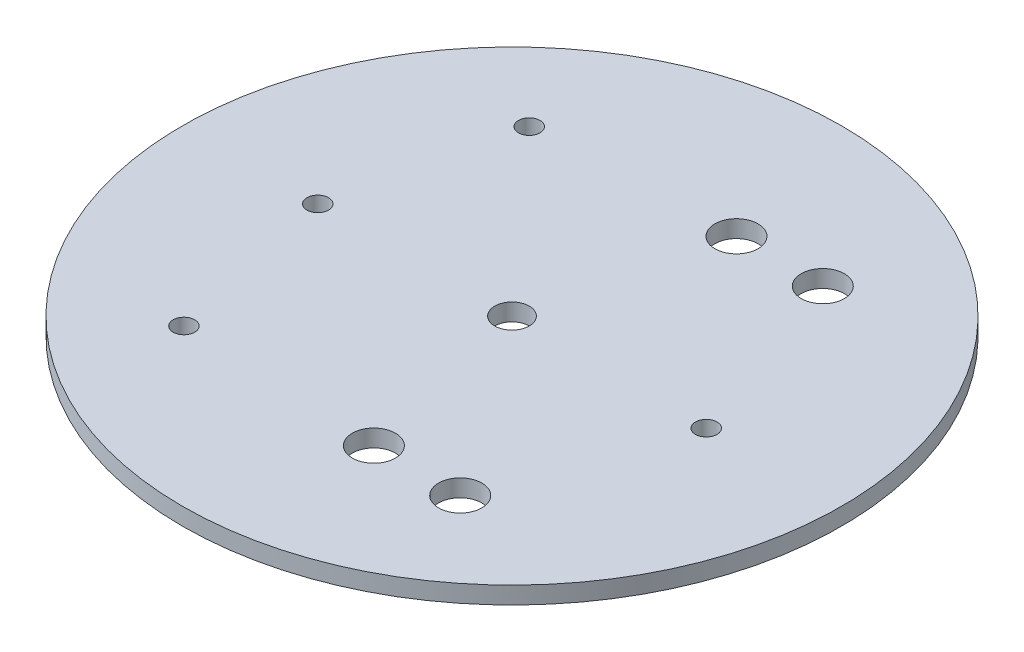
ISO-10303-21;
HEADER;
FILE_DESCRIPTION(('STEP AP214'),'2;1');
FILE_NAME('part.step','',(''),(''),'','','');
FILE_SCHEMA(('AUTOMOTIVE_DESIGN { 1 0 10303 214 1 1 1 1 }'));
ENDSEC;
DATA;
#1=APPLICATION_CONTEXT('core data for automotive mechanical design processes');
#2=APPLICATION_PROTOCOL_DEFINITION('international standard','automotive_design',2000,#1);
#3=PRODUCT_CONTEXT('',#1,'mechanical');
#4=PRODUCT('Part','Part','',(#3));
#5=PRODUCT_RELATED_PRODUCT_CATEGORY('part','',(#4));
#6=PRODUCT_DEFINITION_FORMATION('','',#4);
#7=PRODUCT_DEFINITION_CONTEXT('part definition',#1,'design');
#8=PRODUCT_DEFINITION('design','',#6,#7);
#9=PRODUCT_DEFINITION_SHAPE('','',#8);
#10=(LENGTH_UNIT() NAMED_UNIT(*) SI_UNIT(.MILLI.,.METRE.));
#11=(NAMED_UNIT(*) PLANE_ANGLE_UNIT() SI_UNIT($,.RADIAN.));
#12=(NAMED_UNIT(*) SI_UNIT($,.STERADIAN.) SOLID_ANGLE_UNIT());
#13=UNCERTAINTY_MEASURE_WITH_UNIT(LENGTH_MEASURE(1.E-05),#10,'distance_accuracy_value','');
#14=(GEOMETRIC_REPRESENTATION_CONTEXT(3) GLOBAL_UNCERTAINTY_ASSIGNED_CONTEXT((#13)) GLOBAL_UNIT_ASSIGNED_CONTEXT((#10,
#11,#12)) REPRESENTATION_CONTEXT('',''));
#15=CARTESIAN_POINT('',(0.,0.,0.));
#16=DIRECTION('',(0.,0.,1.));
#17=DIRECTION('',(1.,0.,0.));
#18=AXIS2_PLACEMENT_3D('',#15,#16,#17);
#19=CARTESIAN_POINT('',(30.,4.,42.));
#20=DIRECTION('',(0.,-1.,0.));
#21=DIRECTION('',(0.,0.,-1.));
#22=AXIS2_PLACEMENT_3D('',#19,#20,#21);
#23=CYLINDRICAL_SURFACE('',#22,4.99999999999998);
#24=CARTESIAN_POINT('',(30.,4.,42.));
#25=DIRECTION('',(0.,1.,0.));
#26=DIRECTION('',(0.,0.,1.));
#27=AXIS2_PLACEMENT_3D('',#24,#25,#26);
#28=CIRCLE('',#27,4.99999999999998);
#29=CARTESIAN_POINT('',(30.,4.,47.));
#30=VERTEX_POINT('',#29);
#31=EDGE_CURVE('E47',#30,#30,#28,.F.);
#32=ORIENTED_EDGE('',*,*,#31,.F.);
#33=EDGE_LOOP('',(#32));
#34=FACE_BOUND('',#33,.T.);
#35=CARTESIAN_POINT('',(30.,0.,42.));
#36=DIRECTION('',(0.,1.,0.));
#37=DIRECTION('',(0.,0.,1.));
#38=AXIS2_PLACEMENT_3D('',#35,#36,#37);
#39=CIRCLE('',#38,4.99999999999998);
#40=CARTESIAN_POINT('',(30.,0.,47.));
#41=VERTEX_POINT('',#40);
#42=EDGE_CURVE('E83',#41,#41,#39,.F.);
#43=ORIENTED_EDGE('',*,*,#42,.T.);
#44=EDGE_LOOP('',(#43));
#45=FACE_BOUND('',#44,.T.);
#46=ADVANCED_FACE('F39',(#34,#45),#23,.F.);
#47=CARTESIAN_POINT('',(30.,4.,-42.));
#48=DIRECTION('',(0.,-1.,0.));
#49=DIRECTION('',(0.,0.,-1.));
#50=AXIS2_PLACEMENT_3D('',#47,#48,#49);
#51=CYLINDRICAL_SURFACE('',#50,4.99999999999998);
#52=CARTESIAN_POINT('',(30.,4.,-42.));
#53=DIRECTION('',(0.,1.,0.));
#54=DIRECTION('',(0.,0.,1.));
#55=AXIS2_PLACEMENT_3D('',#52,#53,#54);
#56=CIRCLE('',#55,4.99999999999998);
#57=CARTESIAN_POINT('',(30.,4.,-37.));
#58=VERTEX_POINT('',#57);
#59=EDGE_CURVE('E52',#58,#58,#56,.T.);
#60=ORIENTED_EDGE('',*,*,#59,.T.);
#61=EDGE_LOOP('',(#60));
#62=FACE_BOUND('',#61,.T.);
#63=CARTESIAN_POINT('',(30.,0.,-42.));
#64=DIRECTION('',(0.,1.,0.));
#65=DIRECTION('',(0.,0.,1.));
#66=AXIS2_PLACEMENT_3D('',#63,#64,#65);
#67=CIRCLE('',#66,4.99999999999998);
#68=CARTESIAN_POINT('',(30.,0.,-37.));
#69=VERTEX_POINT('',#68);
#70=EDGE_CURVE('E80',#69,#69,#67,.T.);
#71=ORIENTED_EDGE('',*,*,#70,.F.);
#72=EDGE_LOOP('',(#71));
#73=FACE_BOUND('',#72,.T.);
#74=ADVANCED_FACE('F120',(#62,#73),#51,.F.);
#75=CARTESIAN_POINT('',(9.99999999999999,4.,-42.));
#76=DIRECTION('',(0.,-1.,0.));
#77=DIRECTION('',(0.,0.,-1.));
#78=AXIS2_PLACEMENT_3D('',#75,#76,#77);
#79=CYLINDRICAL_SURFACE('',#78,5.);
#80=CARTESIAN_POINT('',(9.99999999999999,4.,-42.));
#81=DIRECTION('',(0.,1.,0.));
#82=DIRECTION('',(0.,0.,1.));
#83=AXIS2_PLACEMENT_3D('',#80,#81,#82);
#84=CIRCLE('',#83,5.);
#85=CARTESIAN_POINT('',(9.99999999999999,4.,-37.));
#86=VERTEX_POINT('',#85);
#87=EDGE_CURVE('E113',#86,#86,#84,.T.);
#88=ORIENTED_EDGE('',*,*,#87,.T.);
#89=EDGE_LOOP('',(#88));
#90=FACE_BOUND('',#89,.T.);
#91=CARTESIAN_POINT('',(9.99999999999999,0.,-42.));
#92=DIRECTION('',(0.,1.,0.));
#93=DIRECTION('',(0.,0.,1.));
#94=AXIS2_PLACEMENT_3D('',#91,#92,#93);
#95=CIRCLE('',#94,5.);
#96=CARTESIAN_POINT('',(9.99999999999999,0.,-37.));
#97=VERTEX_POINT('',#96);
#98=EDGE_CURVE('E76',#97,#97,#95,.T.);
#99=ORIENTED_EDGE('',*,*,#98,.F.);
#100=EDGE_LOOP('',(#99));
#101=FACE_BOUND('',#100,.T.);
#102=ADVANCED_FACE('F136',(#90,#101),#79,.F.);
#103=CARTESIAN_POINT('',(-36.,4.,-40.));
#104=DIRECTION('',(0.,-1.,0.));
#105=DIRECTION('',(0.,0.,-1.));
#106=AXIS2_PLACEMENT_3D('',#103,#104,#105);
#107=CYLINDRICAL_SURFACE('',#106,2.5);
#108=CARTESIAN_POINT('',(-36.,4.,-40.));
#109=DIRECTION('',(0.,1.,0.));
#110=DIRECTION('',(0.,0.,1.));
#111=AXIS2_PLACEMENT_3D('',#108,#109,#110);
#112=CIRCLE('',#111,2.5);
#113=CARTESIAN_POINT('',(-36.,4.,-37.5));
#114=VERTEX_POINT('',#113);
#115=EDGE_CURVE('E109',#114,#114,#112,.T.);
#116=ORIENTED_EDGE('',*,*,#115,.T.);
#117=EDGE_LOOP('',(#116));
#118=FACE_BOUND('',#117,.T.);
#119=CARTESIAN_POINT('',(-36.,0.,-40.));
#120=DIRECTION('',(0.,1.,0.));
#121=DIRECTION('',(0.,0.,1.));
#122=AXIS2_PLACEMENT_3D('',#119,#120,#121);
#123=CIRCLE('',#122,2.5);
#124=CARTESIAN_POINT('',(-36.,0.,-37.5));
#125=VERTEX_POINT('',#124);
#126=EDGE_CURVE('E72',#125,#125,#123,.T.);
#127=ORIENTED_EDGE('',*,*,#126,.F.);
#128=EDGE_LOOP('',(#127));
#129=FACE_BOUND('',#128,.T.);
#130=ADVANCED_FACE('F143',(#118,#129),#107,.F.);
#131=CARTESIAN_POINT('',(0.,4.,0.));
#132=DIRECTION('',(0.,-1.,0.));
#133=DIRECTION('',(0.,0.,-1.));
#134=AXIS2_PLACEMENT_3D('',#131,#132,#133);
#135=CYLINDRICAL_SURFACE('',#134,4.);
#136=CARTESIAN_POINT('',(0.,4.,0.));
#137=DIRECTION('',(0.,1.,0.));
#138=DIRECTION('',(0.,0.,1.));
#139=AXIS2_PLACEMENT_3D('',#136,#137,#138);
#140=CIRCLE('',#139,4.);
#141=CARTESIAN_POINT('',(0.,4.,4.));
#142=VERTEX_POINT('',#141);
#143=EDGE_CURVE('E106',#142,#142,#140,.T.);
#144=ORIENTED_EDGE('',*,*,#143,.T.);
#145=EDGE_LOOP('',(#144));
#146=FACE_BOUND('',#145,.T.);
#147=CARTESIAN_POINT('',(0.,0.,0.));
#148=DIRECTION('',(0.,1.,0.));
#149=DIRECTION('',(0.,0.,1.));
#150=AXIS2_PLACEMENT_3D('',#147,#148,#149);
#151=CIRCLE('',#150,4.);
#152=CARTESIAN_POINT('',(0.,0.,4.));
#153=VERTEX_POINT('',#152);
#154=EDGE_CURVE('E69',#153,#153,#151,.T.);
#155=ORIENTED_EDGE('',*,*,#154,.F.);
#156=EDGE_LOOP('',(#155));
#157=FACE_BOUND('',#156,.T.);
#158=ADVANCED_FACE('F147',(#146,#157),#135,.F.);
#159=CARTESIAN_POINT('',(45.,4.,0.));
#160=DIRECTION('',(0.,-1.,0.));
#161=DIRECTION('',(0.,0.,-1.));
#162=AXIS2_PLACEMENT_3D('',#159,#160,#161);
#163=CYLINDRICAL_SURFACE('',#162,2.5);
#164=CARTESIAN_POINT('',(45.,4.,0.));
#165=DIRECTION('',(0.,1.,0.));
#166=DIRECTION('',(0.,0.,1.));
#167=AXIS2_PLACEMENT_3D('',#164,#165,#166);
#168=CIRCLE('',#167,2.5);
#169=CARTESIAN_POINT('',(45.,4.,2.49999999999999));
#170=VERTEX_POINT('',#169);
#171=EDGE_CURVE('E103',#170,#170,#168,.T.);
#172=ORIENTED_EDGE('',*,*,#171,.T.);
#173=EDGE_LOOP('',(#172));
#174=FACE_BOUND('',#173,.T.);
#175=CARTESIAN_POINT('',(45.,0.,0.));
#176=DIRECTION('',(0.,1.,0.));
#177=DIRECTION('',(0.,0.,1.));
#178=AXIS2_PLACEMENT_3D('',#175,#176,#177);
#179=CIRCLE('',#178,2.5);
#180=CARTESIAN_POINT('',(45.,0.,2.49999999999999));
#181=VERTEX_POINT('',#180);
#182=EDGE_CURVE('E66',#181,#181,#179,.T.);
#183=ORIENTED_EDGE('',*,*,#182,.F.);
#184=EDGE_LOOP('',(#183));
#185=FACE_BOUND('',#184,.T.);
#186=ADVANCED_FACE('F151',(#174,#185),#163,.F.);
#187=CARTESIAN_POINT('',(-45.,4.,0.));
#188=DIRECTION('',(0.,-1.,0.));
#189=DIRECTION('',(0.,0.,-1.));
#190=AXIS2_PLACEMENT_3D('',#187,#188,#189);
#191=CYLINDRICAL_SURFACE('',#190,2.5);
#192=CARTESIAN_POINT('',(-45.,4.,0.));
#193=DIRECTION('',(0.,1.,0.));
#194=DIRECTION('',(0.,0.,1.));
#195=AXIS2_PLACEMENT_3D('',#192,#193,#194);
#196=CIRCLE('',#195,2.5);
#197=CARTESIAN_POINT('',(-45.,4.,2.50000000000001));
#198=VERTEX_POINT('',#197);
#199=EDGE_CURVE('E98',#198,#198,#196,.T.);
#200=ORIENTED_EDGE('',*,*,#199,.T.);
#201=EDGE_LOOP('',(#200));
#202=FACE_BOUND('',#201,.T.);
#203=CARTESIAN_POINT('',(-45.,0.,0.));
#204=DIRECTION('',(0.,1.,0.));
#205=DIRECTION('',(0.,0.,1.));
#206=AXIS2_PLACEMENT_3D('',#203,#204,#205);
#207=CIRCLE('',#206,2.5);
#208=CARTESIAN_POINT('',(-45.,0.,2.50000000000001));
#209=VERTEX_POINT('',#208);
#210=EDGE_CURVE('E63',#209,#209,#207,.T.);
#211=ORIENTED_EDGE('',*,*,#210,.F.);
#212=EDGE_LOOP('',(#211));
#213=FACE_BOUND('',#212,.T.);
#214=ADVANCED_FACE('F155',(#202,#213),#191,.F.);
#215=CARTESIAN_POINT('',(0.,4.,0.));
#216=DIRECTION('',(0.,-1.,0.));
#217=DIRECTION('',(0.,0.,-1.));
#218=AXIS2_PLACEMENT_3D('',#215,#216,#217);
#219=CYLINDRICAL_SURFACE('',#218,76.35);
#220=CARTESIAN_POINT('',(0.,4.,0.));
#221=DIRECTION('',(0.,1.,0.));
#222=DIRECTION('',(0.,0.,1.));
#223=AXIS2_PLACEMENT_3D('',#220,#221,#222);
#224=CIRCLE('',#223,76.35);
#225=CARTESIAN_POINT('',(0.,4.,76.35));
#226=VERTEX_POINT('',#225);
#227=EDGE_CURVE('E92',#226,#226,#224,.T.);
#228=ORIENTED_EDGE('',*,*,#227,.F.);
#229=EDGE_LOOP('',(#228));
#230=FACE_BOUND('',#229,.T.);
#231=CARTESIAN_POINT('',(0.,0.,0.));
#232=DIRECTION('',(0.,1.,0.));
#233=DIRECTION('',(0.,0.,1.));
#234=AXIS2_PLACEMENT_3D('',#231,#232,#233);
#235=CIRCLE('',#234,76.35);
#236=CARTESIAN_POINT('',(0.,0.,76.35));
#237=VERTEX_POINT('',#236);
#238=EDGE_CURVE('E59',#237,#237,#235,.T.);
#239=ORIENTED_EDGE('',*,*,#238,.T.);
#240=EDGE_LOOP('',(#239));
#241=FACE_BOUND('',#240,.T.);
#242=ADVANCED_FACE('F158',(#230,#241),#219,.T.);
#243=CARTESIAN_POINT('',(10.,4.,42.));
#244=DIRECTION('',(0.,-1.,0.));
#245=DIRECTION('',(0.,0.,-1.));
#246=AXIS2_PLACEMENT_3D('',#243,#244,#245);
#247=CYLINDRICAL_SURFACE('',#246,4.99999999999998);
#248=CARTESIAN_POINT('',(10.,4.,42.));
#249=DIRECTION('',(0.,1.,0.));
#250=DIRECTION('',(0.,0.,1.));
#251=AXIS2_PLACEMENT_3D('',#248,#249,#250);
#252=CIRCLE('',#251,4.99999999999998);
#253=CARTESIAN_POINT('',(10.,4.,47.));
#254=VERTEX_POINT('',#253);
#255=EDGE_CURVE('E88',#254,#254,#252,.F.);
#256=ORIENTED_EDGE('',*,*,#255,.F.);
#257=EDGE_LOOP('',(#256));
#258=FACE_BOUND('',#257,.T.);
#259=CARTESIAN_POINT('',(10.,0.,42.));
#260=DIRECTION('',(0.,1.,0.));
#261=DIRECTION('',(0.,0.,1.));
#262=AXIS2_PLACEMENT_3D('',#259,#260,#261);
#263=CIRCLE('',#262,4.99999999999998);
#264=CARTESIAN_POINT('',(10.,0.,47.));
#265=VERTEX_POINT('',#264);
#266=EDGE_CURVE('E56',#265,#265,#263,.F.);
#267=ORIENTED_EDGE('',*,*,#266,.T.);
#268=EDGE_LOOP('',(#267));
#269=FACE_BOUND('',#268,.T.);
#270=ADVANCED_FACE('F41',(#258,#269),#247,.F.);
#271=CARTESIAN_POINT('',(-36.,4.,40.));
#272=DIRECTION('',(0.,-1.,0.));
#273=DIRECTION('',(0.,0.,-1.));
#274=AXIS2_PLACEMENT_3D('',#271,#272,#273);
#275=CYLINDRICAL_SURFACE('',#274,2.5);
#276=CARTESIAN_POINT('',(-36.,4.,40.));
#277=DIRECTION('',(0.,1.,0.));
#278=DIRECTION('',(0.,0.,1.));
#279=AXIS2_PLACEMENT_3D('',#276,#277,#278);
#280=CIRCLE('',#279,2.5);
#281=CARTESIAN_POINT('',(-36.,4.,42.5));
#282=VERTEX_POINT('',#281);
#283=EDGE_CURVE('E10',#282,#282,#280,.F.);
#284=ORIENTED_EDGE('',*,*,#283,.F.);
#285=EDGE_LOOP('',(#284));
#286=FACE_BOUND('',#285,.T.);
#287=CARTESIAN_POINT('',(-36.,0.,40.));
#288=DIRECTION('',(0.,1.,0.));
#289=DIRECTION('',(0.,0.,1.));
#290=AXIS2_PLACEMENT_3D('',#287,#288,#289);
#291=CIRCLE('',#290,2.5);
#292=CARTESIAN_POINT('',(-36.,0.,42.5));
#293=VERTEX_POINT('',#292);
#294=EDGE_CURVE('E43',#293,#293,#291,.F.);
#295=ORIENTED_EDGE('',*,*,#294,.T.);
#296=EDGE_LOOP('',(#295));
#297=FACE_BOUND('',#296,.T.);
#298=ADVANCED_FACE('F127',(#286,#297),#275,.F.);
#299=CARTESIAN_POINT('',(0.,4.,0.));
#300=DIRECTION('',(0.,1.,0.));
#301=DIRECTION('',(0.,0.,1.));
#302=AXIS2_PLACEMENT_3D('',#299,#300,#301);
#303=PLANE('',#302);
#304=ORIENTED_EDGE('',*,*,#255,.T.);
#305=EDGE_LOOP('',(#304));
#306=FACE_BOUND('',#305,.T.);
#307=ORIENTED_EDGE('',*,*,#227,.T.);
#308=EDGE_LOOP('',(#307));
#309=FACE_BOUND('',#308,.T.);
#310=ORIENTED_EDGE('',*,*,#199,.F.);
#311=EDGE_LOOP('',(#310));
#312=FACE_BOUND('',#311,.T.);
#313=ORIENTED_EDGE('',*,*,#171,.F.);
#314=EDGE_LOOP('',(#313));
#315=FACE_BOUND('',#314,.T.);
#316=ORIENTED_EDGE('',*,*,#143,.F.);
#317=EDGE_LOOP('',(#316));
#318=FACE_BOUND('',#317,.T.);
#319=ORIENTED_EDGE('',*,*,#115,.F.);
#320=EDGE_LOOP('',(#319));
#321=FACE_BOUND('',#320,.T.);
#322=ORIENTED_EDGE('',*,*,#87,.F.);
#323=EDGE_LOOP('',(#322));
#324=FACE_BOUND('',#323,.T.);
#325=ORIENTED_EDGE('',*,*,#59,.F.);
#326=EDGE_LOOP('',(#325));
#327=FACE_BOUND('',#326,.T.);
#328=ORIENTED_EDGE('',*,*,#31,.T.);
#329=EDGE_LOOP('',(#328));
#330=FACE_BOUND('',#329,.T.);
#331=ORIENTED_EDGE('',*,*,#283,.T.);
#332=EDGE_LOOP('',(#331));
#333=FACE_BOUND('',#332,.T.);
#334=ADVANCED_FACE('F123',(#306,#309,#312,#315,#318,#321,#324,#327,#330,#333),#303,.T.);
#335=CARTESIAN_POINT('',(0.,0.,0.));
#336=DIRECTION('',(0.,1.,0.));
#337=DIRECTION('',(0.,0.,1.));
#338=AXIS2_PLACEMENT_3D('',#335,#336,#337);
#339=PLANE('',#338);
#340=ORIENTED_EDGE('',*,*,#266,.F.);
#341=EDGE_LOOP('',(#340));
#342=FACE_BOUND('',#341,.T.);
#343=ORIENTED_EDGE('',*,*,#238,.F.);
#344=EDGE_LOOP('',(#343));
#345=FACE_BOUND('',#344,.T.);
#346=ORIENTED_EDGE('',*,*,#210,.T.);
#347=EDGE_LOOP('',(#346));
#348=FACE_BOUND('',#347,.T.);
#349=ORIENTED_EDGE('',*,*,#182,.T.);
#350=EDGE_LOOP('',(#349));
#351=FACE_BOUND('',#350,.T.);
#352=ORIENTED_EDGE('',*,*,#154,.T.);
#353=EDGE_LOOP('',(#352));
#354=FACE_BOUND('',#353,.T.);
#355=ORIENTED_EDGE('',*,*,#126,.T.);
#356=EDGE_LOOP('',(#355));
#357=FACE_BOUND('',#356,.T.);
#358=ORIENTED_EDGE('',*,*,#98,.T.);
#359=EDGE_LOOP('',(#358));
#360=FACE_BOUND('',#359,.T.);
#361=ORIENTED_EDGE('',*,*,#70,.T.);
#362=EDGE_LOOP('',(#361));
#363=FACE_BOUND('',#362,.T.);
#364=ORIENTED_EDGE('',*,*,#42,.F.);
#365=EDGE_LOOP('',(#364));
#366=FACE_BOUND('',#365,.T.);
#367=ORIENTED_EDGE('',*,*,#294,.F.);
#368=EDGE_LOOP('',(#367));
#369=FACE_BOUND('',#368,.T.);
#370=ADVANCED_FACE('F126',(#342,#345,#348,#351,#354,#357,#360,#363,#366,#369),#339,.F.);
#371=CLOSED_SHELL('',(#46,#74,#102,#130,#158,#186,#214,#242,#270,#298,#334,#370));
#372=MANIFOLD_SOLID_BREP('B2',#371);
#373=ADVANCED_BREP_SHAPE_REPRESENTATION('',(#18,#372),#14);
#374=SHAPE_DEFINITION_REPRESENTATION(#9,#373);
ENDSEC;
END-ISO-10303-21;
